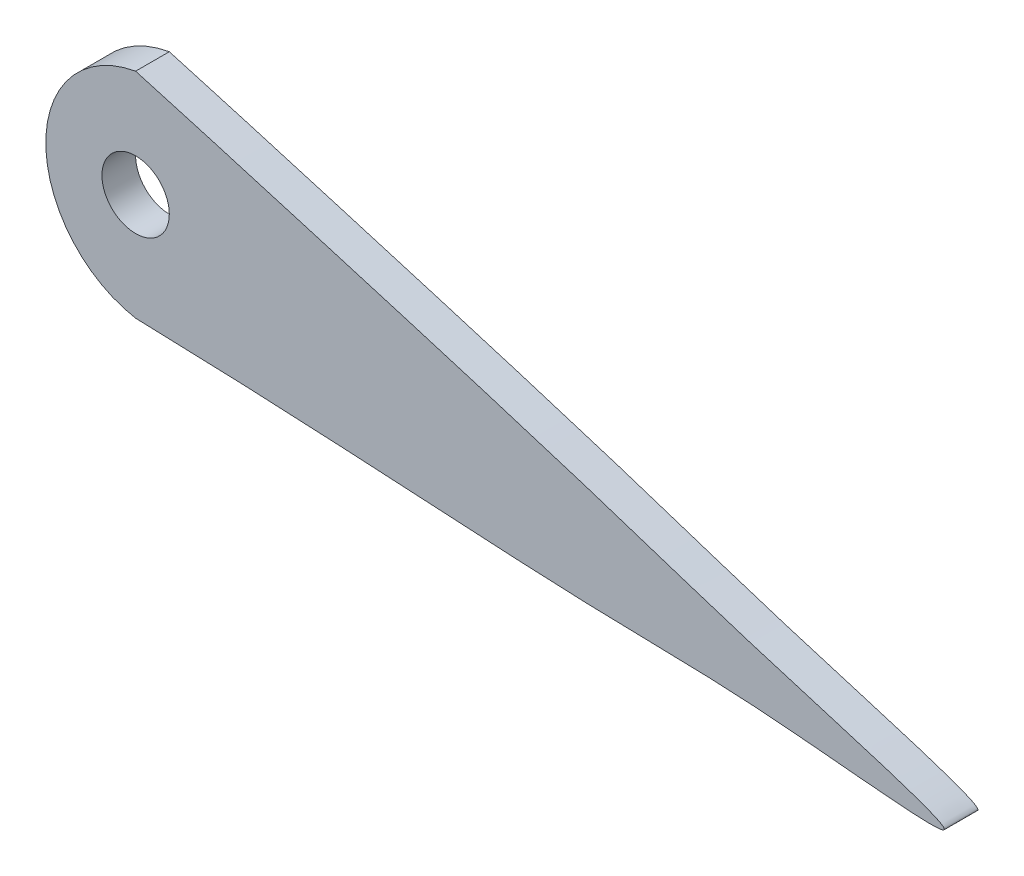
ISO-10303-21;
HEADER;
FILE_DESCRIPTION(('STEP AP214'),'2;1');
FILE_NAME('part.step','',(''),(''),'','','');
FILE_SCHEMA(('AUTOMOTIVE_DESIGN { 1 0 10303 214 1 1 1 1 }'));
ENDSEC;
DATA;
#1=APPLICATION_CONTEXT('core data for automotive mechanical design processes');
#2=APPLICATION_PROTOCOL_DEFINITION('international standard','automotive_design',2000,#1);
#3=PRODUCT_CONTEXT('',#1,'mechanical');
#4=PRODUCT('Part','Part','',(#3));
#5=PRODUCT_RELATED_PRODUCT_CATEGORY('part','',(#4));
#6=PRODUCT_DEFINITION_FORMATION('','',#4);
#7=PRODUCT_DEFINITION_CONTEXT('part definition',#1,'design');
#8=PRODUCT_DEFINITION('design','',#6,#7);
#9=PRODUCT_DEFINITION_SHAPE('','',#8);
#10=(LENGTH_UNIT() NAMED_UNIT(*) SI_UNIT(.MILLI.,.METRE.));
#11=(NAMED_UNIT(*) PLANE_ANGLE_UNIT() SI_UNIT($,.RADIAN.));
#12=(NAMED_UNIT(*) SI_UNIT($,.STERADIAN.) SOLID_ANGLE_UNIT());
#13=UNCERTAINTY_MEASURE_WITH_UNIT(LENGTH_MEASURE(1.E-05),#10,'distance_accuracy_value','');
#14=(GEOMETRIC_REPRESENTATION_CONTEXT(3) GLOBAL_UNCERTAINTY_ASSIGNED_CONTEXT((#13)) GLOBAL_UNIT_ASSIGNED_CONTEXT((#10,
#11,#12)) REPRESENTATION_CONTEXT('',''));
#15=CARTESIAN_POINT('',(0.,0.,0.));
#16=DIRECTION('',(0.,0.,1.));
#17=DIRECTION('',(1.,0.,0.));
#18=AXIS2_PLACEMENT_3D('',#15,#16,#17);
#19=CARTESIAN_POINT('',(1.65605512116519,14.4639878907678,3.175));
#20=DIRECTION('',(0.,0.,-1.));
#21=DIRECTION('',(-1.,0.,0.));
#22=AXIS2_PLACEMENT_3D('',#19,#20,#21);
#23=PLANE('',#22);
#24=CARTESIAN_POINT('',(228.6,13.7136378450758,3.175));
#25=DIRECTION('',(0.,0.,1.));
#26=DIRECTION('',(1.,0.,0.));
#27=AXIS2_PLACEMENT_3D('',#24,#25,#26);
#28=CIRCLE('',#27,3.175);
#29=CARTESIAN_POINT('',(231.775,13.7136378450758,3.175));
#30=VERTEX_POINT('',#29);
#31=EDGE_CURVE('E193',#30,#30,#28,.T.);
#32=ORIENTED_EDGE('',*,*,#31,.F.);
#33=EDGE_LOOP('',(#32));
#34=FACE_BOUND('',#33,.T.);
#35=DIRECTION('',(0.,1.,0.));
#36=VECTOR('',#35,1.);
#37=CARTESIAN_POINT('',(220.155261275493,14.4639878907678,3.175));
#38=LINE('',#37,#36);
#39=CARTESIAN_POINT('',(220.155261275493,13.0887307806902,3.175));
#40=VERTEX_POINT('',#39);
#41=CARTESIAN_POINT('',(220.155261275493,14.3385449094915,3.175));
#42=VERTEX_POINT('',#41);
#43=EDGE_CURVE('E161',#40,#42,#38,.T.);
#44=ORIENTED_EDGE('',*,*,#43,.F.);
#45=CARTESIAN_POINT('',(230.370312983993,13.7136378450908,3.175));
#46=DIRECTION('',(0.,0.,-1.));
#47=DIRECTION('',(-1.,0.,0.));
#48=AXIS2_PLACEMENT_3D('',#45,#46,#47);
#49=CIRCLE('',#48,10.2341482423534);
#50=CARTESIAN_POINT('',(228.600000000146,3.63376769782749,3.175));
#51=VERTEX_POINT('',#50);
#52=EDGE_CURVE('E189',#51,#40,#49,.T.);
#53=ORIENTED_EDGE('',*,*,#52,.F.);
#54=CARTESIAN_POINT('',(304.8,0.,3.175));
#55=CARTESIAN_POINT('',(305.077640244681,0.670235949008001,3.175));
#56=CARTESIAN_POINT('',(287.206651557549,5.72014346783749,3.175));
#57=CARTESIAN_POINT('',(270.662795429074,11.3970544887587,3.175));
#58=CARTESIAN_POINT('',(243.463273841648,19.4859206004711,3.175));
#59=CARTESIAN_POINT('',(213.747912644984,28.2099572247865,3.175));
#60=CARTESIAN_POINT('',(183.040246215652,34.6765948811052,3.175));
#61=CARTESIAN_POINT('',(152.4919465254,38.6289899500206,3.175));
#62=CARTESIAN_POINT('',(121.966980876844,41.172895409398,3.175));
#63=CARTESIAN_POINT('',(91.4149280659883,41.7230127486465,3.175));
#64=CARTESIAN_POINT('',(65.9274954962046,40.0620135064187,3.175));
#65=CARTESIAN_POINT('',(45.6250038216973,37.0045999100277,3.175));
#66=CARTESIAN_POINT('',(32.7277103548807,34.3521427962271,3.175));
#67=CARTESIAN_POINT('',(22.7317956157464,30.1965290437229,3.175));
#68=CARTESIAN_POINT('',(14.9072257071245,26.4612505881115,3.175));
#69=CARTESIAN_POINT('',(8.51628352714233,21.9644178457254,3.175));
#70=CARTESIAN_POINT('',(2.53745558093638,16.4884644553953,3.175));
#71=CARTESIAN_POINT('',(-1.96447989389202,8.89390689304449,3.175));
#72=CARTESIAN_POINT('',(2.84193009807859,2.33492302764709,3.175));
#73=CARTESIAN_POINT('',(8.77882949074113,0.629027732179887,3.175));
#74=CARTESIAN_POINT('',(15.2287936628024,0.221834685012508,3.175));
#75=CARTESIAN_POINT('',(22.8635764639965,0.239109805904665,3.175));
#76=CARTESIAN_POINT('',(33.0156316728747,0.788100741553244,3.175));
#77=CARTESIAN_POINT('',(45.7404190780474,0.855312608130182,3.175));
#78=CARTESIAN_POINT('',(66.0183969786535,2.65839434977953,3.175));
#79=CARTESIAN_POINT('',(91.4265780864865,3.79492631367271,3.175));
#80=CARTESIAN_POINT('',(121.915270130211,4.33221739110161,3.175));
#81=CARTESIAN_POINT('',(152.408348669622,4.47906680792443,3.175));
#82=CARTESIAN_POINT('',(182.849810214161,4.26910364888094,3.175));
#83=CARTESIAN_POINT('',(213.479164171133,4.04767027141658,3.175));
#84=CARTESIAN_POINT('',(243.430144591887,3.31397178943146,3.175));
#85=CARTESIAN_POINT('',(270.486497521151,1.37051361290602,3.175));
#86=CARTESIAN_POINT('',(287.394329758651,1.44240402655394,3.175));
#87=CARTESIAN_POINT('',(304.536665056553,-0.635702313008765,3.175));
#88=CARTESIAN_POINT('',(304.8,0.,3.175));
#89=B_SPLINE_CURVE_WITH_KNOTS('',3,(#54,#55,#56,#57,#58,#59,#60,#61,#62,#63,#64,#65,#66,#67,#68,
#69,#70,#71,#72,#73,#74,#75,#76,#77,#78,#79,#80,#81,#82,#83,#84,#85,#86,#87,#88),.UNSPECIFIED.,
.T.,.F.,(4,1,1,1,1,1,1,1,1,1,1,1,1,1,1,1,1,1,1,1,1,1,1,1,1,1,1,1,1,1,1,1,4),(0.,
0.0255560444991772,0.050960447010779,0.101552747326171,0.151805437773323,0.201252492284918,
0.250083001864764,0.298629140589189,0.347026117124877,0.395536064294317,0.420002518911991,
0.444885367904301,0.457915186872697,0.47144103148067,0.486208379890319,0.494593530866719,
0.510948222410887,0.521394630718682,0.527823605666163,0.539981827808652,0.552079711007262,
0.564187268644203,0.588393920687583,0.612648894272303,0.661100878724036,0.709502088857399,
0.75789422654222,0.80628636422704,0.854680316537635,0.903093620624395,0.951545605076128,
0.975760720350009,1.),.UNSPECIFIED.);
#90=CARTESIAN_POINT('',(228.599999999981,23.7935079923252,3.175));
#91=VERTEX_POINT('',#90);
#92=EDGE_CURVE('E185',#51,#91,#89,.T.);
#93=ORIENTED_EDGE('',*,*,#92,.T.);
#94=EDGE_CURVE('E231',#42,#91,#49,.T.);
#95=ORIENTED_EDGE('',*,*,#94,.F.);
#96=EDGE_LOOP('',(#44,#53,#93,#95));
#97=FACE_BOUND('',#96,.T.);
#98=ADVANCED_FACE('F120',(#34,#97),#23,.F.);
#99=CARTESIAN_POINT('',(1.65605512116519,14.4639878907678,0.));
#100=DIRECTION('',(0.,0.,-1.));
#101=DIRECTION('',(-1.,0.,0.));
#102=AXIS2_PLACEMENT_3D('',#99,#100,#101);
#103=PLANE('',#102);
#104=CARTESIAN_POINT('',(228.6,13.7136378450758,0.));
#105=DIRECTION('',(0.,0.,1.));
#106=DIRECTION('',(1.,0.,0.));
#107=AXIS2_PLACEMENT_3D('',#104,#105,#106);
#108=CIRCLE('',#107,3.175);
#109=CARTESIAN_POINT('',(231.775,13.7136378450758,0.));
#110=VERTEX_POINT('',#109);
#111=EDGE_CURVE('E179',#110,#110,#108,.T.);
#112=ORIENTED_EDGE('',*,*,#111,.T.);
#113=EDGE_LOOP('',(#112));
#114=FACE_BOUND('',#113,.T.);
#115=CARTESIAN_POINT('',(230.370312983993,13.7136378450908,0.));
#116=DIRECTION('',(0.,0.,-1.));
#117=DIRECTION('',(-1.,0.,0.));
#118=AXIS2_PLACEMENT_3D('',#115,#116,#117);
#119=CIRCLE('',#118,10.2341482423534);
#120=CARTESIAN_POINT('',(228.600000000146,3.63376769782749,0.));
#121=VERTEX_POINT('',#120);
#122=CARTESIAN_POINT('',(220.155261275493,13.0887307806902,0.));
#123=VERTEX_POINT('',#122);
#124=EDGE_CURVE('E171',#121,#123,#119,.T.);
#125=ORIENTED_EDGE('',*,*,#124,.T.);
#126=DIRECTION('',(0.,-1.,0.));
#127=VECTOR('',#126,1.);
#128=CARTESIAN_POINT('',(220.155261275493,27.2890582203791,0.));
#129=LINE('',#128,#127);
#130=CARTESIAN_POINT('',(220.155261275493,14.3385449094915,0.));
#131=VERTEX_POINT('',#130);
#132=EDGE_CURVE('E135',#131,#123,#129,.T.);
#133=ORIENTED_EDGE('',*,*,#132,.F.);
#134=CARTESIAN_POINT('',(228.599999999981,23.7935079923252,0.));
#135=VERTEX_POINT('',#134);
#136=EDGE_CURVE('E169',#131,#135,#119,.T.);
#137=ORIENTED_EDGE('',*,*,#136,.T.);
#138=CARTESIAN_POINT('',(304.8,0.,0.));
#139=CARTESIAN_POINT('',(305.077640244681,0.670235949008001,0.));
#140=CARTESIAN_POINT('',(287.206651557549,5.72014346783749,0.));
#141=CARTESIAN_POINT('',(270.662795429074,11.3970544887587,0.));
#142=CARTESIAN_POINT('',(243.463273841648,19.4859206004711,0.));
#143=CARTESIAN_POINT('',(213.747912644984,28.2099572247865,0.));
#144=CARTESIAN_POINT('',(183.040246215652,34.6765948811052,0.));
#145=CARTESIAN_POINT('',(152.4919465254,38.6289899500206,0.));
#146=CARTESIAN_POINT('',(121.966980876844,41.172895409398,0.));
#147=CARTESIAN_POINT('',(91.4149280659883,41.7230127486465,0.));
#148=CARTESIAN_POINT('',(65.9274954962046,40.0620135064187,0.));
#149=CARTESIAN_POINT('',(45.6250038216973,37.0045999100277,0.));
#150=CARTESIAN_POINT('',(32.7277103548807,34.3521427962271,0.));
#151=CARTESIAN_POINT('',(22.7317956157464,30.1965290437229,0.));
#152=CARTESIAN_POINT('',(14.9072257071245,26.4612505881115,0.));
#153=CARTESIAN_POINT('',(8.51628352714233,21.9644178457254,0.));
#154=CARTESIAN_POINT('',(2.53745558093638,16.4884644553953,0.));
#155=CARTESIAN_POINT('',(-1.96447989389202,8.89390689304449,0.));
#156=CARTESIAN_POINT('',(2.84193009807859,2.33492302764709,0.));
#157=CARTESIAN_POINT('',(8.77882949074113,0.629027732179887,0.));
#158=CARTESIAN_POINT('',(15.2287936628024,0.221834685012508,0.));
#159=CARTESIAN_POINT('',(22.8635764639965,0.239109805904665,0.));
#160=CARTESIAN_POINT('',(33.0156316728747,0.788100741553244,0.));
#161=CARTESIAN_POINT('',(45.7404190780474,0.855312608130182,0.));
#162=CARTESIAN_POINT('',(66.0183969786535,2.65839434977953,0.));
#163=CARTESIAN_POINT('',(91.4265780864865,3.79492631367271,0.));
#164=CARTESIAN_POINT('',(121.915270130211,4.33221739110161,0.));
#165=CARTESIAN_POINT('',(152.408348669622,4.47906680792443,0.));
#166=CARTESIAN_POINT('',(182.849810214161,4.26910364888094,0.));
#167=CARTESIAN_POINT('',(213.479164171133,4.04767027141658,0.));
#168=CARTESIAN_POINT('',(243.430144591887,3.31397178943146,0.));
#169=CARTESIAN_POINT('',(270.486497521151,1.37051361290602,0.));
#170=CARTESIAN_POINT('',(287.394329758651,1.44240402655394,0.));
#171=CARTESIAN_POINT('',(304.536665056553,-0.635702313008765,0.));
#172=CARTESIAN_POINT('',(304.8,0.,0.));
#173=B_SPLINE_CURVE_WITH_KNOTS('',3,(#138,#139,#140,#141,#142,#143,#144,#145,#146,#147,#148,
#149,#150,#151,#152,#153,#154,#155,#156,#157,#158,#159,#160,#161,#162,#163,#164,#165,#166,#167,
#168,#169,#170,#171,#172),.UNSPECIFIED.,.T.,.F.,(4,1,1,1,1,1,1,1,1,1,1,1,1,1,1,1,1,1,1,1,1,1,1,
1,1,1,1,1,1,1,1,1,4),(0.,0.0255560444991772,0.050960447010779,0.101552747326171,
0.151805437773323,0.201252492284918,0.250083001864764,0.298629140589189,0.347026117124877,
0.395536064294317,0.420002518911991,0.444885367904301,0.457915186872697,0.47144103148067,
0.486208379890319,0.494593530866719,0.510948222410887,0.521394630718682,0.527823605666163,
0.539981827808652,0.552079711007262,0.564187268644203,0.588393920687583,0.612648894272303,
0.661100878724036,0.709502088857399,0.75789422654222,0.80628636422704,0.854680316537635,
0.903093620624395,0.951545605076128,0.975760720350009,1.),.UNSPECIFIED.);
#174=EDGE_CURVE('E183',#121,#135,#173,.T.);
#175=ORIENTED_EDGE('',*,*,#174,.F.);
#176=EDGE_LOOP('',(#125,#133,#137,#175));
#177=FACE_BOUND('',#176,.T.);
#178=ADVANCED_FACE('F167',(#114,#177),#103,.T.);
#179=CARTESIAN_POINT('',(230.370312983993,13.7136378450908,5.08));
#180=DIRECTION('',(0.,0.,-1.));
#181=DIRECTION('',(-1.,0.,0.));
#182=AXIS2_PLACEMENT_3D('',#179,#180,#181);
#183=CYLINDRICAL_SURFACE('',#182,10.2341482423534);
#184=ORIENTED_EDGE('',*,*,#136,.F.);
#185=DIRECTION('',(0.,0.,-1.));
#186=VECTOR('',#185,1.);
#187=CARTESIAN_POINT('',(220.155261275493,14.3385449094915,5.08));
#188=LINE('',#187,#186);
#189=EDGE_CURVE('E12',#131,#42,#188,.F.);
#190=ORIENTED_EDGE('',*,*,#189,.T.);
#191=ORIENTED_EDGE('',*,*,#94,.T.);
#192=DIRECTION('',(0.,0.,-1.));
#193=VECTOR('',#192,1.);
#194=CARTESIAN_POINT('',(228.599999999982,23.7935079923249,3.175));
#195=LINE('',#194,#193);
#196=EDGE_CURVE('E176',#135,#91,#195,.F.);
#197=ORIENTED_EDGE('',*,*,#196,.F.);
#198=EDGE_LOOP('',(#184,#190,#191,#197));
#199=FACE_BOUND('',#198,.T.);
#200=ADVANCED_FACE('F174',(#199),#183,.T.);
#201=ORIENTED_EDGE('',*,*,#52,.T.);
#202=DIRECTION('',(0.,0.,-1.));
#203=VECTOR('',#202,1.);
#204=CARTESIAN_POINT('',(220.155261275493,13.0887307806902,5.08));
#205=LINE('',#204,#203);
#206=EDGE_CURVE('E128',#40,#123,#205,.T.);
#207=ORIENTED_EDGE('',*,*,#206,.T.);
#208=ORIENTED_EDGE('',*,*,#124,.F.);
#209=DIRECTION('',(0.,0.,-1.));
#210=VECTOR('',#209,1.);
#211=CARTESIAN_POINT('',(228.600000000146,3.63376769782749,3.175));
#212=LINE('',#211,#210);
#213=EDGE_CURVE('E143',#121,#51,#212,.F.);
#214=ORIENTED_EDGE('',*,*,#213,.T.);
#215=EDGE_LOOP('',(#201,#207,#208,#214));
#216=FACE_BOUND('',#215,.T.);
#217=ADVANCED_FACE('F210',(#216),#183,.T.);
#218=DIRECTION('',(0.,0.,-1.));
#219=VECTOR('',#218,1.);
#220=SURFACE_OF_LINEAR_EXTRUSION('',#89,#219);
#221=ORIENTED_EDGE('',*,*,#174,.T.);
#222=ORIENTED_EDGE('',*,*,#196,.T.);
#223=ORIENTED_EDGE('',*,*,#92,.F.);
#224=ORIENTED_EDGE('',*,*,#213,.F.);
#225=EDGE_LOOP('',(#221,#222,#223,#224));
#226=FACE_BOUND('',#225,.T.);
#227=ADVANCED_FACE('F206',(#226),#220,.F.);
#228=CARTESIAN_POINT('',(228.6,13.7136378450758,3.175));
#229=DIRECTION('',(0.,0.,-1.));
#230=DIRECTION('',(-1.,0.,0.));
#231=AXIS2_PLACEMENT_3D('',#228,#229,#230);
#232=CYLINDRICAL_SURFACE('',#231,3.175);
#233=ORIENTED_EDGE('',*,*,#31,.T.);
#234=EDGE_LOOP('',(#233));
#235=FACE_BOUND('',#234,.T.);
#236=ORIENTED_EDGE('',*,*,#111,.F.);
#237=EDGE_LOOP('',(#236));
#238=FACE_BOUND('',#237,.T.);
#239=ADVANCED_FACE('F209',(#235,#238),#232,.F.);
#240=CARTESIAN_POINT('',(220.155261275493,27.2890582203791,0.));
#241=DIRECTION('',(-1.,0.,0.));
#242=DIRECTION('',(0.,0.,1.));
#243=AXIS2_PLACEMENT_3D('',#240,#241,#242);
#244=PLANE('',#243);
#245=ORIENTED_EDGE('',*,*,#132,.T.);
#246=ORIENTED_EDGE('',*,*,#206,.F.);
#247=ORIENTED_EDGE('',*,*,#43,.T.);
#248=ORIENTED_EDGE('',*,*,#189,.F.);
#249=EDGE_LOOP('',(#245,#246,#247,#248));
#250=FACE_BOUND('',#249,.T.);
#251=ADVANCED_FACE('F159',(#250),#244,.T.);
#252=CLOSED_SHELL('',(#98,#178,#200,#217,#227,#239,#251));
#253=MANIFOLD_SOLID_BREP('B2',#252);
#254=ADVANCED_BREP_SHAPE_REPRESENTATION('',(#18,#253),#14);
#255=SHAPE_DEFINITION_REPRESENTATION(#9,#254);
ENDSEC;
END-ISO-10303-21;
